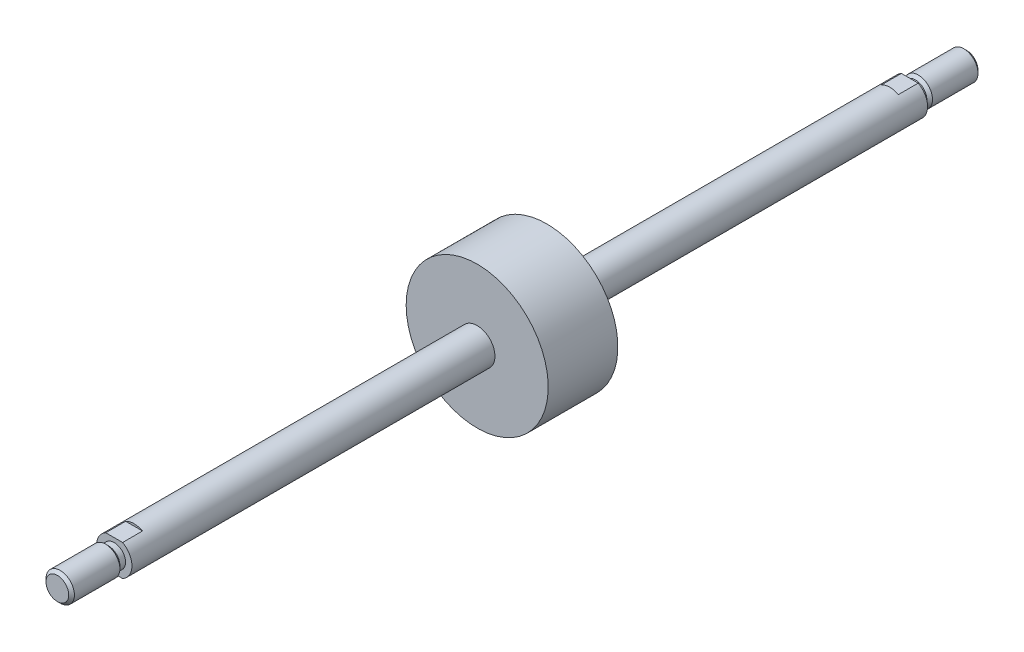
ISO-10303-21;
HEADER;
FILE_DESCRIPTION(('STEP AP214'),'2;1');
FILE_NAME('part.step','',(''),(''),'','','');
FILE_SCHEMA(('AUTOMOTIVE_DESIGN { 1 0 10303 214 1 1 1 1 }'));
ENDSEC;
DATA;
#1=APPLICATION_CONTEXT('core data for automotive mechanical design processes');
#2=APPLICATION_PROTOCOL_DEFINITION('international standard','automotive_design',2000,#1);
#3=PRODUCT_CONTEXT('',#1,'mechanical');
#4=PRODUCT('Part','Part','',(#3));
#5=PRODUCT_RELATED_PRODUCT_CATEGORY('part','',(#4));
#6=PRODUCT_DEFINITION_FORMATION('','',#4);
#7=PRODUCT_DEFINITION_CONTEXT('part definition',#1,'design');
#8=PRODUCT_DEFINITION('design','',#6,#7);
#9=PRODUCT_DEFINITION_SHAPE('','',#8);
#10=(LENGTH_UNIT() NAMED_UNIT(*) SI_UNIT(.MILLI.,.METRE.));
#11=(NAMED_UNIT(*) PLANE_ANGLE_UNIT() SI_UNIT($,.RADIAN.));
#12=(NAMED_UNIT(*) SI_UNIT($,.STERADIAN.) SOLID_ANGLE_UNIT());
#13=UNCERTAINTY_MEASURE_WITH_UNIT(LENGTH_MEASURE(1.E-05),#10,'distance_accuracy_value','');
#14=(GEOMETRIC_REPRESENTATION_CONTEXT(3) GLOBAL_UNCERTAINTY_ASSIGNED_CONTEXT((#13)) GLOBAL_UNIT_ASSIGNED_CONTEXT((#10,
#11,#12)) REPRESENTATION_CONTEXT('',''));
#15=CARTESIAN_POINT('',(0.,0.,0.));
#16=DIRECTION('',(0.,0.,1.));
#17=DIRECTION('',(1.,0.,0.));
#18=AXIS2_PLACEMENT_3D('',#15,#16,#17);
#19=CARTESIAN_POINT('',(4.00000000000005,0.,-504.5));
#20=DIRECTION('',(0.,0.,-1.));
#21=DIRECTION('',(-1.,0.,0.));
#22=AXIS2_PLACEMENT_3D('',#19,#20,#21);
#23=PLANE('',#22);
#24=CARTESIAN_POINT('',(0.,0.,-504.500000000897));
#25=DIRECTION('',(0.,0.,1.));
#26=DIRECTION('',(1.,0.,0.));
#27=AXIS2_PLACEMENT_3D('',#24,#25,#26);
#28=CIRCLE('',#27,8.00000000089753);
#29=CARTESIAN_POINT('',(8.00000000089753,0.,-504.500000000897));
#30=VERTEX_POINT('',#29);
#31=EDGE_CURVE('E20',#30,#30,#28,.T.);
#32=ORIENTED_EDGE('',*,*,#31,.F.);
#33=EDGE_LOOP('',(#32));
#34=FACE_BOUND('',#33,.T.);
#35=ADVANCED_FACE('F16',(#34),#23,.T.);
#36=CARTESIAN_POINT('',(0.,0.,-502.499999999102));
#37=DIRECTION('',(0.,0.,1.));
#38=DIRECTION('',(1.,0.,0.));
#39=AXIS2_PLACEMENT_3D('',#36,#37,#38);
#40=CONICAL_SURFACE('',#39,9.99999999910295,0.785398162499967);
#41=CARTESIAN_POINT('',(0.,0.,-502.499999999999));
#42=DIRECTION('',(0.,0.,1.));
#43=DIRECTION('',(1.,0.,0.));
#44=AXIS2_PLACEMENT_3D('',#41,#42,#43);
#45=CIRCLE('',#44,10.0000000000003);
#46=CARTESIAN_POINT('',(10.0000000000003,0.,-502.499999999999));
#47=VERTEX_POINT('',#46);
#48=EDGE_CURVE('E137',#47,#47,#45,.T.);
#49=ORIENTED_EDGE('',*,*,#48,.F.);
#50=EDGE_LOOP('',(#49));
#51=FACE_BOUND('',#50,.T.);
#52=ORIENTED_EDGE('',*,*,#31,.T.);
#53=EDGE_LOOP('',(#52));
#54=FACE_BOUND('',#53,.T.);
#55=ADVANCED_FACE('F392',(#51,#54),#40,.T.);
#56=CARTESIAN_POINT('',(0.,0.,-486.5));
#57=DIRECTION('',(0.,0.,1.));
#58=DIRECTION('',(1.,0.,0.));
#59=AXIS2_PLACEMENT_3D('',#56,#57,#58);
#60=CYLINDRICAL_SURFACE('',#59,10.0000000000003);
#61=CARTESIAN_POINT('',(0.,0.,-470.500000000898));
#62=DIRECTION('',(0.,0.,-1.));
#63=DIRECTION('',(1.,0.,0.));
#64=AXIS2_PLACEMENT_3D('',#61,#62,#63);
#65=CIRCLE('',#64,9.99999999910276);
#66=CARTESIAN_POINT('',(9.99999999910276,0.,-470.500000000898));
#67=VERTEX_POINT('',#66);
#68=EDGE_CURVE('E134',#67,#67,#65,.F.);
#69=ORIENTED_EDGE('',*,*,#68,.F.);
#70=EDGE_LOOP('',(#69));
#71=FACE_BOUND('',#70,.T.);
#72=ORIENTED_EDGE('',*,*,#48,.T.);
#73=EDGE_LOOP('',(#72));
#74=FACE_BOUND('',#73,.T.);
#75=ADVANCED_FACE('F383',(#71,#74),#60,.T.);
#76=CARTESIAN_POINT('',(0.,0.,-470.500000000898));
#77=DIRECTION('',(0.,0.,-1.));
#78=DIRECTION('',(-1.,0.,0.));
#79=AXIS2_PLACEMENT_3D('',#76,#77,#78);
#80=CONICAL_SURFACE('',#79,9.99999999910278,0.785398162499997);
#81=CARTESIAN_POINT('',(0.,0.,-468.5));
#82=DIRECTION('',(0.,0.,1.));
#83=DIRECTION('',(1.,0.,0.));
#84=AXIS2_PLACEMENT_3D('',#81,#82,#83);
#85=CIRCLE('',#84,8.00000000000018);
#86=CARTESIAN_POINT('',(8.00000000000018,0.,-468.5));
#87=VERTEX_POINT('',#86);
#88=EDGE_CURVE('E86',#87,#87,#85,.T.);
#89=ORIENTED_EDGE('',*,*,#88,.F.);
#90=EDGE_LOOP('',(#89));
#91=FACE_BOUND('',#90,.T.);
#92=ORIENTED_EDGE('',*,*,#68,.T.);
#93=EDGE_LOOP('',(#92));
#94=FACE_BOUND('',#93,.T.);
#95=ADVANCED_FACE('F374',(#91,#94),#80,.T.);
#96=CARTESIAN_POINT('',(0.,0.,-466.5));
#97=DIRECTION('',(0.,0.,1.));
#98=DIRECTION('',(1.,0.,0.));
#99=AXIS2_PLACEMENT_3D('',#96,#97,#98);
#100=CYLINDRICAL_SURFACE('',#99,8.00000000000018);
#101=CARTESIAN_POINT('',(0.,0.,-464.5));
#102=DIRECTION('',(0.,0.,1.));
#103=DIRECTION('',(1.,0.,0.));
#104=AXIS2_PLACEMENT_3D('',#101,#102,#103);
#105=CIRCLE('',#104,8.00000000000018);
#106=CARTESIAN_POINT('',(8.00000000000018,0.,-464.5));
#107=VERTEX_POINT('',#106);
#108=EDGE_CURVE('E109',#107,#107,#105,.T.);
#109=ORIENTED_EDGE('',*,*,#108,.F.);
#110=EDGE_LOOP('',(#109));
#111=FACE_BOUND('',#110,.T.);
#112=ORIENTED_EDGE('',*,*,#88,.T.);
#113=EDGE_LOOP('',(#112));
#114=FACE_BOUND('',#113,.T.);
#115=ADVANCED_FACE('F366',(#111,#114),#100,.T.);
#116=CARTESIAN_POINT('',(4.,0.,135.5));
#117=DIRECTION('',(0.,0.,1.));
#118=DIRECTION('',(1.,0.,0.));
#119=AXIS2_PLACEMENT_3D('',#116,#117,#118);
#120=PLANE('',#119);
#121=CARTESIAN_POINT('',(0.,0.,135.500000000898));
#122=DIRECTION('',(0.,0.,-1.));
#123=DIRECTION('',(0.,1.,0.));
#124=AXIS2_PLACEMENT_3D('',#121,#122,#123);
#125=CIRCLE('',#124,8.00000000089744);
#126=CARTESIAN_POINT('',(0.,8.00000000089744,135.500000000898));
#127=VERTEX_POINT('',#126);
#128=EDGE_CURVE('E103',#127,#127,#125,.T.);
#129=ORIENTED_EDGE('',*,*,#128,.F.);
#130=EDGE_LOOP('',(#129));
#131=FACE_BOUND('',#130,.T.);
#132=ADVANCED_FACE('F358',(#131),#120,.T.);
#133=CARTESIAN_POINT('',(5.9371710435191,-12.5150000000001,-450.5));
#134=DIRECTION('',(0.,0.,1.));
#135=DIRECTION('',(0.,1.,0.));
#136=AXIS2_PLACEMENT_3D('',#133,#134,#135);
#137=PLANE('',#136);
#138=DIRECTION('',(1.,0.,0.));
#139=VECTOR('',#138,1.);
#140=CARTESIAN_POINT('',(0.,-11.,-450.5));
#141=LINE('',#140,#139);
#142=CARTESIAN_POINT('',(-5.93717104351911,-11.,-450.5));
#143=VERTEX_POINT('',#142);
#144=CARTESIAN_POINT('',(5.9371710435191,-11.,-450.5));
#145=VERTEX_POINT('',#144);
#146=EDGE_CURVE('E77',#143,#145,#141,.T.);
#147=ORIENTED_EDGE('',*,*,#146,.T.);
#148=CARTESIAN_POINT('',(0.,0.,-450.5));
#149=DIRECTION('',(0.,0.,1.));
#150=DIRECTION('',(1.,0.,0.));
#151=AXIS2_PLACEMENT_3D('',#148,#149,#150);
#152=CIRCLE('',#151,12.5000000000001);
#153=EDGE_CURVE('E81',#143,#145,#152,.T.);
#154=ORIENTED_EDGE('',*,*,#153,.F.);
#155=EDGE_LOOP('',(#147,#154));
#156=FACE_BOUND('',#155,.T.);
#157=ADVANCED_FACE('F79',(#156),#137,.F.);
#158=CARTESIAN_POINT('',(5.9371710435191,-11.,-450.5));
#159=DIRECTION('',(0.,1.,0.));
#160=DIRECTION('',(0.,0.,-1.));
#161=AXIS2_PLACEMENT_3D('',#158,#159,#160);
#162=PLANE('',#161);
#163=DIRECTION('',(-1.,0.,0.));
#164=VECTOR('',#163,1.);
#165=CARTESIAN_POINT('',(4.00000000000019,-11.,-464.5));
#166=LINE('',#165,#164);
#167=CARTESIAN_POINT('',(5.9371710435191,-11.,-464.5));
#168=VERTEX_POINT('',#167);
#169=CARTESIAN_POINT('',(-5.93717104351911,-11.,-464.5));
#170=VERTEX_POINT('',#169);
#171=EDGE_CURVE('E93',#168,#170,#166,.T.);
#172=ORIENTED_EDGE('',*,*,#171,.F.);
#173=DIRECTION('',(0.,0.,1.));
#174=VECTOR('',#173,1.);
#175=CARTESIAN_POINT('',(5.9371710435191,-11.,-184.5));
#176=LINE('',#175,#174);
#177=EDGE_CURVE('E90',#145,#168,#176,.F.);
#178=ORIENTED_EDGE('',*,*,#177,.F.);
#179=ORIENTED_EDGE('',*,*,#146,.F.);
#180=DIRECTION('',(0.,0.,1.));
#181=VECTOR('',#180,1.);
#182=CARTESIAN_POINT('',(-5.93717104351911,-11.,-184.5));
#183=LINE('',#182,#181);
#184=EDGE_CURVE('E101',#170,#143,#183,.T.);
#185=ORIENTED_EDGE('',*,*,#184,.F.);
#186=EDGE_LOOP('',(#172,#178,#179,#185));
#187=FACE_BOUND('',#186,.T.);
#188=ADVANCED_FACE('F91',(#187),#162,.F.);
#189=CARTESIAN_POINT('',(5.93717104351908,11.,-450.5));
#190=DIRECTION('',(0.,0.,1.));
#191=DIRECTION('',(0.,1.,0.));
#192=AXIS2_PLACEMENT_3D('',#189,#190,#191);
#193=PLANE('',#192);
#194=DIRECTION('',(-1.,0.,0.));
#195=VECTOR('',#194,1.);
#196=CARTESIAN_POINT('',(0.,11.,-450.5));
#197=LINE('',#196,#195);
#198=CARTESIAN_POINT('',(5.93717104351908,11.,-450.5));
#199=VERTEX_POINT('',#198);
#200=CARTESIAN_POINT('',(-5.93717104351909,11.,-450.5));
#201=VERTEX_POINT('',#200);
#202=EDGE_CURVE('E85',#199,#201,#197,.T.);
#203=ORIENTED_EDGE('',*,*,#202,.T.);
#204=CARTESIAN_POINT('',(0.,0.,-450.5));
#205=DIRECTION('',(0.,0.,1.));
#206=DIRECTION('',(1.,0.,0.));
#207=AXIS2_PLACEMENT_3D('',#204,#205,#206);
#208=CIRCLE('',#207,12.5000000000001);
#209=EDGE_CURVE('E127',#199,#201,#208,.T.);
#210=ORIENTED_EDGE('',*,*,#209,.F.);
#211=EDGE_LOOP('',(#203,#210));
#212=FACE_BOUND('',#211,.T.);
#213=ADVANCED_FACE('F174',(#212),#193,.F.);
#214=CARTESIAN_POINT('',(5.93717104351908,11.,-464.5));
#215=DIRECTION('',(0.,-1.,0.));
#216=DIRECTION('',(0.,0.,1.));
#217=AXIS2_PLACEMENT_3D('',#214,#215,#216);
#218=PLANE('',#217);
#219=DIRECTION('',(-1.,0.,0.));
#220=VECTOR('',#219,1.);
#221=CARTESIAN_POINT('',(4.00000000000019,11.,-464.5));
#222=LINE('',#221,#220);
#223=CARTESIAN_POINT('',(-5.93717104351909,11.,-464.5));
#224=VERTEX_POINT('',#223);
#225=CARTESIAN_POINT('',(5.93717104351908,11.,-464.5));
#226=VERTEX_POINT('',#225);
#227=EDGE_CURVE('E111',#224,#226,#222,.F.);
#228=ORIENTED_EDGE('',*,*,#227,.F.);
#229=DIRECTION('',(0.,0.,1.));
#230=VECTOR('',#229,1.);
#231=CARTESIAN_POINT('',(-5.93717104351909,11.,-184.5));
#232=LINE('',#231,#230);
#233=EDGE_CURVE('E123',#201,#224,#232,.F.);
#234=ORIENTED_EDGE('',*,*,#233,.F.);
#235=ORIENTED_EDGE('',*,*,#202,.F.);
#236=DIRECTION('',(0.,0.,1.));
#237=VECTOR('',#236,1.);
#238=CARTESIAN_POINT('',(5.93717104351908,11.,-184.5));
#239=LINE('',#238,#237);
#240=EDGE_CURVE('E129',#226,#199,#239,.T.);
#241=ORIENTED_EDGE('',*,*,#240,.F.);
#242=EDGE_LOOP('',(#228,#234,#235,#241));
#243=FACE_BOUND('',#242,.T.);
#244=ADVANCED_FACE('F18',(#243),#218,.F.);
#245=CARTESIAN_POINT('',(4.00000000000019,0.,-464.5));
#246=DIRECTION('',(0.,0.,-1.));
#247=DIRECTION('',(-1.,0.,0.));
#248=AXIS2_PLACEMENT_3D('',#245,#246,#247);
#249=PLANE('',#248);
#250=ORIENTED_EDGE('',*,*,#108,.T.);
#251=EDGE_LOOP('',(#250));
#252=FACE_BOUND('',#251,.T.);
#253=CARTESIAN_POINT('',(0.,0.,-464.5));
#254=DIRECTION('',(0.,0.,1.));
#255=DIRECTION('',(1.,0.,0.));
#256=AXIS2_PLACEMENT_3D('',#253,#254,#255);
#257=CIRCLE('',#256,12.5000000000001);
#258=EDGE_CURVE('E96',#168,#226,#257,.T.);
#259=ORIENTED_EDGE('',*,*,#258,.F.);
#260=ORIENTED_EDGE('',*,*,#171,.T.);
#261=CARTESIAN_POINT('',(0.,0.,-464.5));
#262=DIRECTION('',(0.,0.,1.));
#263=DIRECTION('',(1.,0.,0.));
#264=AXIS2_PLACEMENT_3D('',#261,#262,#263);
#265=CIRCLE('',#264,12.5000000000001);
#266=EDGE_CURVE('E126',#224,#170,#265,.T.);
#267=ORIENTED_EDGE('',*,*,#266,.F.);
#268=ORIENTED_EDGE('',*,*,#227,.T.);
#269=EDGE_LOOP('',(#259,#260,#267,#268));
#270=FACE_BOUND('',#269,.T.);
#271=ADVANCED_FACE('F176',(#252,#270),#249,.T.);
#272=CARTESIAN_POINT('',(0.,0.,133.499999999103));
#273=DIRECTION('',(0.,0.,-1.));
#274=DIRECTION('',(0.,1.,0.));
#275=AXIS2_PLACEMENT_3D('',#272,#273,#274);
#276=CONICAL_SURFACE('',#275,9.99999999910255,0.7853981625);
#277=CARTESIAN_POINT('',(0.,0.,133.5));
#278=DIRECTION('',(0.,0.,1.));
#279=DIRECTION('',(1.,0.,0.));
#280=AXIS2_PLACEMENT_3D('',#277,#278,#279);
#281=CIRCLE('',#280,10.);
#282=CARTESIAN_POINT('',(10.,0.,133.5));
#283=VERTEX_POINT('',#282);
#284=EDGE_CURVE('E120',#283,#283,#281,.F.);
#285=ORIENTED_EDGE('',*,*,#284,.F.);
#286=EDGE_LOOP('',(#285));
#287=FACE_BOUND('',#286,.T.);
#288=ORIENTED_EDGE('',*,*,#128,.T.);
#289=EDGE_LOOP('',(#288));
#290=FACE_BOUND('',#289,.T.);
#291=ADVANCED_FACE('F178',(#287,#290),#276,.T.);
#292=CARTESIAN_POINT('',(0.,0.,-184.5));
#293=DIRECTION('',(0.,0.,1.));
#294=DIRECTION('',(1.,0.,0.));
#295=AXIS2_PLACEMENT_3D('',#292,#293,#294);
#296=CYLINDRICAL_SURFACE('',#295,12.5000000000001);
#297=ORIENTED_EDGE('',*,*,#177,.T.);
#298=ORIENTED_EDGE('',*,*,#258,.T.);
#299=ORIENTED_EDGE('',*,*,#240,.T.);
#300=ORIENTED_EDGE('',*,*,#209,.T.);
#301=ORIENTED_EDGE('',*,*,#233,.T.);
#302=ORIENTED_EDGE('',*,*,#266,.T.);
#303=ORIENTED_EDGE('',*,*,#184,.T.);
#304=ORIENTED_EDGE('',*,*,#153,.T.);
#305=EDGE_LOOP('',(#297,#298,#299,#300,#301,#302,#303,#304));
#306=FACE_BOUND('',#305,.T.);
#307=CARTESIAN_POINT('',(0.,0.,-209.));
#308=DIRECTION('',(0.,0.,1.));
#309=DIRECTION('',(1.,0.,0.));
#310=AXIS2_PLACEMENT_3D('',#307,#308,#309);
#311=CIRCLE('',#310,12.5000000000001);
#312=CARTESIAN_POINT('',(12.5000000000001,0.,-209.));
#313=VERTEX_POINT('',#312);
#314=EDGE_CURVE('E167',#313,#313,#311,.F.);
#315=ORIENTED_EDGE('',*,*,#314,.T.);
#316=EDGE_LOOP('',(#315));
#317=FACE_BOUND('',#316,.T.);
#318=ADVANCED_FACE('F98',(#306,#317),#296,.T.);
#319=CARTESIAN_POINT('',(0.,0.,117.5));
#320=DIRECTION('',(0.,0.,1.));
#321=DIRECTION('',(1.,0.,0.));
#322=AXIS2_PLACEMENT_3D('',#319,#320,#321);
#323=CYLINDRICAL_SURFACE('',#322,10.);
#324=CARTESIAN_POINT('',(0.,0.,101.500000000898));
#325=DIRECTION('',(0.,0.,1.));
#326=DIRECTION('',(1.,0.,0.));
#327=AXIS2_PLACEMENT_3D('',#324,#325,#326);
#328=CIRCLE('',#327,9.99999999910255);
#329=CARTESIAN_POINT('',(9.99999999910255,0.,101.500000000898));
#330=VERTEX_POINT('',#329);
#331=EDGE_CURVE('E166',#330,#330,#328,.F.);
#332=ORIENTED_EDGE('',*,*,#331,.F.);
#333=EDGE_LOOP('',(#332));
#334=FACE_BOUND('',#333,.T.);
#335=ORIENTED_EDGE('',*,*,#284,.T.);
#336=EDGE_LOOP('',(#335));
#337=FACE_BOUND('',#336,.T.);
#338=ADVANCED_FACE('F234',(#334,#337),#323,.T.);
#339=CARTESIAN_POINT('',(0.,0.,-209.));
#340=DIRECTION('',(0.,0.,1.));
#341=DIRECTION('',(1.,0.,0.));
#342=AXIS2_PLACEMENT_3D('',#339,#340,#341);
#343=PLANE('',#342);
#344=ORIENTED_EDGE('',*,*,#314,.F.);
#345=EDGE_LOOP('',(#344));
#346=FACE_BOUND('',#345,.T.);
#347=CARTESIAN_POINT('',(0.,0.,-209.));
#348=DIRECTION('',(0.,0.,-1.));
#349=DIRECTION('',(-1.,0.,0.));
#350=AXIS2_PLACEMENT_3D('',#347,#348,#349);
#351=CIRCLE('',#350,50.);
#352=CARTESIAN_POINT('',(-50.,0.,-209.));
#353=VERTEX_POINT('',#352);
#354=EDGE_CURVE('E162',#353,#353,#351,.F.);
#355=ORIENTED_EDGE('',*,*,#354,.F.);
#356=EDGE_LOOP('',(#355));
#357=FACE_BOUND('',#356,.T.);
#358=ADVANCED_FACE('F230',(#346,#357),#343,.F.);
#359=CARTESIAN_POINT('',(0.,0.,101.500000000898));
#360=DIRECTION('',(0.,0.,1.));
#361=DIRECTION('',(1.,0.,0.));
#362=AXIS2_PLACEMENT_3D('',#359,#360,#361);
#363=CONICAL_SURFACE('',#362,9.99999999910255,0.7853981625);
#364=CARTESIAN_POINT('',(0.,0.,99.5000000000001));
#365=DIRECTION('',(0.,0.,1.));
#366=DIRECTION('',(1.,0.,0.));
#367=AXIS2_PLACEMENT_3D('',#364,#365,#366);
#368=CIRCLE('',#367,8.);
#369=CARTESIAN_POINT('',(8.,0.,99.5000000000001));
#370=VERTEX_POINT('',#369);
#371=EDGE_CURVE('E161',#370,#370,#368,.F.);
#372=ORIENTED_EDGE('',*,*,#371,.F.);
#373=EDGE_LOOP('',(#372));
#374=FACE_BOUND('',#373,.T.);
#375=ORIENTED_EDGE('',*,*,#331,.T.);
#376=EDGE_LOOP('',(#375));
#377=FACE_BOUND('',#376,.T.);
#378=ADVANCED_FACE('F226',(#374,#377),#363,.T.);
#379=CARTESIAN_POINT('',(0.,0.,-209.));
#380=DIRECTION('',(0.,0.,-1.));
#381=DIRECTION('',(-1.,0.,0.));
#382=AXIS2_PLACEMENT_3D('',#379,#380,#381);
#383=CYLINDRICAL_SURFACE('',#382,50.);
#384=CARTESIAN_POINT('',(0.,0.,-160.));
#385=DIRECTION('',(0.,0.,-1.));
#386=DIRECTION('',(-1.,0.,0.));
#387=AXIS2_PLACEMENT_3D('',#384,#385,#386);
#388=CIRCLE('',#387,50.);
#389=CARTESIAN_POINT('',(-50.,0.,-160.));
#390=VERTEX_POINT('',#389);
#391=EDGE_CURVE('E158',#390,#390,#388,.F.);
#392=ORIENTED_EDGE('',*,*,#391,.F.);
#393=EDGE_LOOP('',(#392));
#394=FACE_BOUND('',#393,.T.);
#395=ORIENTED_EDGE('',*,*,#354,.T.);
#396=EDGE_LOOP('',(#395));
#397=FACE_BOUND('',#396,.T.);
#398=ADVANCED_FACE('F222',(#394,#397),#383,.T.);
#399=CARTESIAN_POINT('',(0.,-16.5,81.5000000000001));
#400=DIRECTION('',(0.,0.,-1.));
#401=DIRECTION('',(-1.,0.,0.));
#402=AXIS2_PLACEMENT_3D('',#399,#400,#401);
#403=PLANE('',#402);
#404=DIRECTION('',(1.,0.,0.));
#405=VECTOR('',#404,1.);
#406=CARTESIAN_POINT('',(10.,-11.,81.5000000000001));
#407=LINE('',#406,#405);
#408=CARTESIAN_POINT('',(5.9371710435191,-11.,81.5000000000001));
#409=VERTEX_POINT('',#408);
#410=CARTESIAN_POINT('',(-5.93717104351911,-11.,81.5000000000001));
#411=VERTEX_POINT('',#410);
#412=EDGE_CURVE('E165',#409,#411,#407,.F.);
#413=ORIENTED_EDGE('',*,*,#412,.T.);
#414=CARTESIAN_POINT('',(0.,0.,81.5000000000001));
#415=DIRECTION('',(0.,0.,1.));
#416=DIRECTION('',(1.,0.,0.));
#417=AXIS2_PLACEMENT_3D('',#414,#415,#416);
#418=CIRCLE('',#417,12.5000000000001);
#419=EDGE_CURVE('E153',#409,#411,#418,.F.);
#420=ORIENTED_EDGE('',*,*,#419,.F.);
#421=EDGE_LOOP('',(#413,#420));
#422=FACE_BOUND('',#421,.T.);
#423=ADVANCED_FACE('F218',(#422),#403,.F.);
#424=CARTESIAN_POINT('',(10.,-11.,95.5000000000001));
#425=DIRECTION('',(0.,1.,0.));
#426=DIRECTION('',(0.,0.,1.));
#427=AXIS2_PLACEMENT_3D('',#424,#425,#426);
#428=PLANE('',#427);
#429=ORIENTED_EDGE('',*,*,#412,.F.);
#430=DIRECTION('',(0.,0.,1.));
#431=VECTOR('',#430,1.);
#432=CARTESIAN_POINT('',(5.9371710435191,-11.,-184.5));
#433=LINE('',#432,#431);
#434=CARTESIAN_POINT('',(5.9371710435191,-11.,95.5000000000001));
#435=VERTEX_POINT('',#434);
#436=EDGE_CURVE('E157',#435,#409,#433,.F.);
#437=ORIENTED_EDGE('',*,*,#436,.F.);
#438=DIRECTION('',(1.,0.,0.));
#439=VECTOR('',#438,1.);
#440=CARTESIAN_POINT('',(10.25,-11.,95.5000000000001));
#441=LINE('',#440,#439);
#442=CARTESIAN_POINT('',(-5.93717104351911,-11.,95.5000000000001));
#443=VERTEX_POINT('',#442);
#444=EDGE_CURVE('E450',#443,#435,#441,.T.);
#445=ORIENTED_EDGE('',*,*,#444,.F.);
#446=DIRECTION('',(0.,0.,1.));
#447=VECTOR('',#446,1.);
#448=CARTESIAN_POINT('',(-5.93717104351911,-11.,-184.5));
#449=LINE('',#448,#447);
#450=EDGE_CURVE('E156',#411,#443,#449,.T.);
#451=ORIENTED_EDGE('',*,*,#450,.F.);
#452=EDGE_LOOP('',(#429,#437,#445,#451));
#453=FACE_BOUND('',#452,.T.);
#454=ADVANCED_FACE('F214',(#453),#428,.F.);
#455=CARTESIAN_POINT('',(0.,0.,97.5000000000001));
#456=DIRECTION('',(0.,0.,1.));
#457=DIRECTION('',(1.,0.,0.));
#458=AXIS2_PLACEMENT_3D('',#455,#456,#457);
#459=CYLINDRICAL_SURFACE('',#458,8.);
#460=CARTESIAN_POINT('',(0.,0.,95.5000000000001));
#461=DIRECTION('',(0.,0.,1.));
#462=DIRECTION('',(1.,0.,0.));
#463=AXIS2_PLACEMENT_3D('',#460,#461,#462);
#464=CIRCLE('',#463,8.);
#465=CARTESIAN_POINT('',(8.,0.,95.5000000000001));
#466=VERTEX_POINT('',#465);
#467=EDGE_CURVE('E150',#466,#466,#464,.F.);
#468=ORIENTED_EDGE('',*,*,#467,.F.);
#469=EDGE_LOOP('',(#468));
#470=FACE_BOUND('',#469,.T.);
#471=ORIENTED_EDGE('',*,*,#371,.T.);
#472=EDGE_LOOP('',(#471));
#473=FACE_BOUND('',#472,.T.);
#474=ADVANCED_FACE('F210',(#470,#473),#459,.T.);
#475=CARTESIAN_POINT('',(0.,0.,-160.));
#476=DIRECTION('',(0.,0.,1.));
#477=DIRECTION('',(1.,0.,0.));
#478=AXIS2_PLACEMENT_3D('',#475,#476,#477);
#479=PLANE('',#478);
#480=CARTESIAN_POINT('',(0.,0.,-160.));
#481=DIRECTION('',(0.,0.,1.));
#482=DIRECTION('',(1.,0.,0.));
#483=AXIS2_PLACEMENT_3D('',#480,#481,#482);
#484=CIRCLE('',#483,12.5000000000001);
#485=CARTESIAN_POINT('',(12.5000000000001,0.,-160.));
#486=VERTEX_POINT('',#485);
#487=EDGE_CURVE('E147',#486,#486,#484,.T.);
#488=ORIENTED_EDGE('',*,*,#487,.F.);
#489=EDGE_LOOP('',(#488));
#490=FACE_BOUND('',#489,.T.);
#491=ORIENTED_EDGE('',*,*,#391,.T.);
#492=EDGE_LOOP('',(#491));
#493=FACE_BOUND('',#492,.T.);
#494=ADVANCED_FACE('F206',(#490,#493),#479,.T.);
#495=CARTESIAN_POINT('',(0.,16.5,81.5000000000001));
#496=DIRECTION('',(0.,0.,-1.));
#497=DIRECTION('',(-1.,0.,0.));
#498=AXIS2_PLACEMENT_3D('',#495,#496,#497);
#499=PLANE('',#498);
#500=DIRECTION('',(1.,0.,0.));
#501=VECTOR('',#500,1.);
#502=CARTESIAN_POINT('',(-10.,11.,81.5000000000001));
#503=LINE('',#502,#501);
#504=CARTESIAN_POINT('',(-5.93717104351909,11.,81.5000000000001));
#505=VERTEX_POINT('',#504);
#506=CARTESIAN_POINT('',(5.93717104351908,11.,81.5000000000001));
#507=VERTEX_POINT('',#506);
#508=EDGE_CURVE('E446',#505,#507,#503,.T.);
#509=ORIENTED_EDGE('',*,*,#508,.T.);
#510=CARTESIAN_POINT('',(0.,0.,81.5000000000001));
#511=DIRECTION('',(0.,0.,1.));
#512=DIRECTION('',(1.,0.,0.));
#513=AXIS2_PLACEMENT_3D('',#510,#511,#512);
#514=CIRCLE('',#513,12.5000000000001);
#515=EDGE_CURVE('E140',#505,#507,#514,.F.);
#516=ORIENTED_EDGE('',*,*,#515,.F.);
#517=EDGE_LOOP('',(#509,#516));
#518=FACE_BOUND('',#517,.T.);
#519=ADVANCED_FACE('F203',(#518),#499,.F.);
#520=CARTESIAN_POINT('',(-10.,11.,95.5000000000001));
#521=DIRECTION('',(0.,-1.,0.));
#522=DIRECTION('',(0.,0.,-1.));
#523=AXIS2_PLACEMENT_3D('',#520,#521,#522);
#524=PLANE('',#523);
#525=ORIENTED_EDGE('',*,*,#508,.F.);
#526=DIRECTION('',(0.,0.,1.));
#527=VECTOR('',#526,1.);
#528=CARTESIAN_POINT('',(-5.93717104351909,11.,-184.5));
#529=LINE('',#528,#527);
#530=CARTESIAN_POINT('',(-5.93717104351909,11.,95.5000000000001));
#531=VERTEX_POINT('',#530);
#532=EDGE_CURVE('E143',#531,#505,#529,.F.);
#533=ORIENTED_EDGE('',*,*,#532,.F.);
#534=DIRECTION('',(1.,0.,0.));
#535=VECTOR('',#534,1.);
#536=CARTESIAN_POINT('',(10.25,11.,95.5000000000001));
#537=LINE('',#536,#535);
#538=CARTESIAN_POINT('',(5.93717104351908,11.,95.5000000000001));
#539=VERTEX_POINT('',#538);
#540=EDGE_CURVE('E35',#539,#531,#537,.F.);
#541=ORIENTED_EDGE('',*,*,#540,.F.);
#542=DIRECTION('',(0.,0.,1.));
#543=VECTOR('',#542,1.);
#544=CARTESIAN_POINT('',(5.93717104351908,11.,-184.5));
#545=LINE('',#544,#543);
#546=EDGE_CURVE('E26',#507,#539,#545,.T.);
#547=ORIENTED_EDGE('',*,*,#546,.F.);
#548=EDGE_LOOP('',(#525,#533,#541,#547));
#549=FACE_BOUND('',#548,.T.);
#550=ADVANCED_FACE('F196',(#549),#524,.F.);
#551=CARTESIAN_POINT('',(10.25,0.,95.5000000000001));
#552=DIRECTION('',(0.,0.,1.));
#553=DIRECTION('',(1.,0.,0.));
#554=AXIS2_PLACEMENT_3D('',#551,#552,#553);
#555=PLANE('',#554);
#556=ORIENTED_EDGE('',*,*,#467,.T.);
#557=EDGE_LOOP('',(#556));
#558=FACE_BOUND('',#557,.T.);
#559=CARTESIAN_POINT('',(0.,0.,95.5000000000001));
#560=DIRECTION('',(0.,0.,1.));
#561=DIRECTION('',(1.,0.,0.));
#562=AXIS2_PLACEMENT_3D('',#559,#560,#561);
#563=CIRCLE('',#562,12.5000000000001);
#564=EDGE_CURVE('E144',#443,#531,#563,.F.);
#565=ORIENTED_EDGE('',*,*,#564,.F.);
#566=ORIENTED_EDGE('',*,*,#444,.T.);
#567=CARTESIAN_POINT('',(0.,0.,95.5000000000001));
#568=DIRECTION('',(0.,0.,1.));
#569=DIRECTION('',(1.,0.,0.));
#570=AXIS2_PLACEMENT_3D('',#567,#568,#569);
#571=CIRCLE('',#570,12.5000000000001);
#572=EDGE_CURVE('E10',#539,#435,#571,.F.);
#573=ORIENTED_EDGE('',*,*,#572,.F.);
#574=ORIENTED_EDGE('',*,*,#540,.T.);
#575=EDGE_LOOP('',(#565,#566,#573,#574));
#576=FACE_BOUND('',#575,.T.);
#577=ADVANCED_FACE('F190',(#558,#576),#555,.T.);
#578=CARTESIAN_POINT('',(0.,0.,-184.5));
#579=DIRECTION('',(0.,0.,1.));
#580=DIRECTION('',(1.,0.,0.));
#581=AXIS2_PLACEMENT_3D('',#578,#579,#580);
#582=CYLINDRICAL_SURFACE('',#581,12.5000000000001);
#583=ORIENTED_EDGE('',*,*,#487,.T.);
#584=EDGE_LOOP('',(#583));
#585=FACE_BOUND('',#584,.T.);
#586=ORIENTED_EDGE('',*,*,#546,.T.);
#587=ORIENTED_EDGE('',*,*,#572,.T.);
#588=ORIENTED_EDGE('',*,*,#436,.T.);
#589=ORIENTED_EDGE('',*,*,#419,.T.);
#590=ORIENTED_EDGE('',*,*,#450,.T.);
#591=ORIENTED_EDGE('',*,*,#564,.T.);
#592=ORIENTED_EDGE('',*,*,#532,.T.);
#593=ORIENTED_EDGE('',*,*,#515,.T.);
#594=EDGE_LOOP('',(#586,#587,#588,#589,#590,#591,#592,#593));
#595=FACE_BOUND('',#594,.T.);
#596=ADVANCED_FACE('F188',(#585,#595),#582,.T.);
#597=CLOSED_SHELL('',(#35,#55,#75,#95,#115,#132,#157,#188,#213,#244,#271,#291,#318,#338,#358,
#378,#398,#423,#454,#474,#494,#519,#550,#577,#596));
#598=MANIFOLD_SOLID_BREP('B1',#597);
#599=ADVANCED_BREP_SHAPE_REPRESENTATION('',(#18,#598),#14);
#600=SHAPE_DEFINITION_REPRESENTATION(#9,#599);
ENDSEC;
END-ISO-10303-21;
